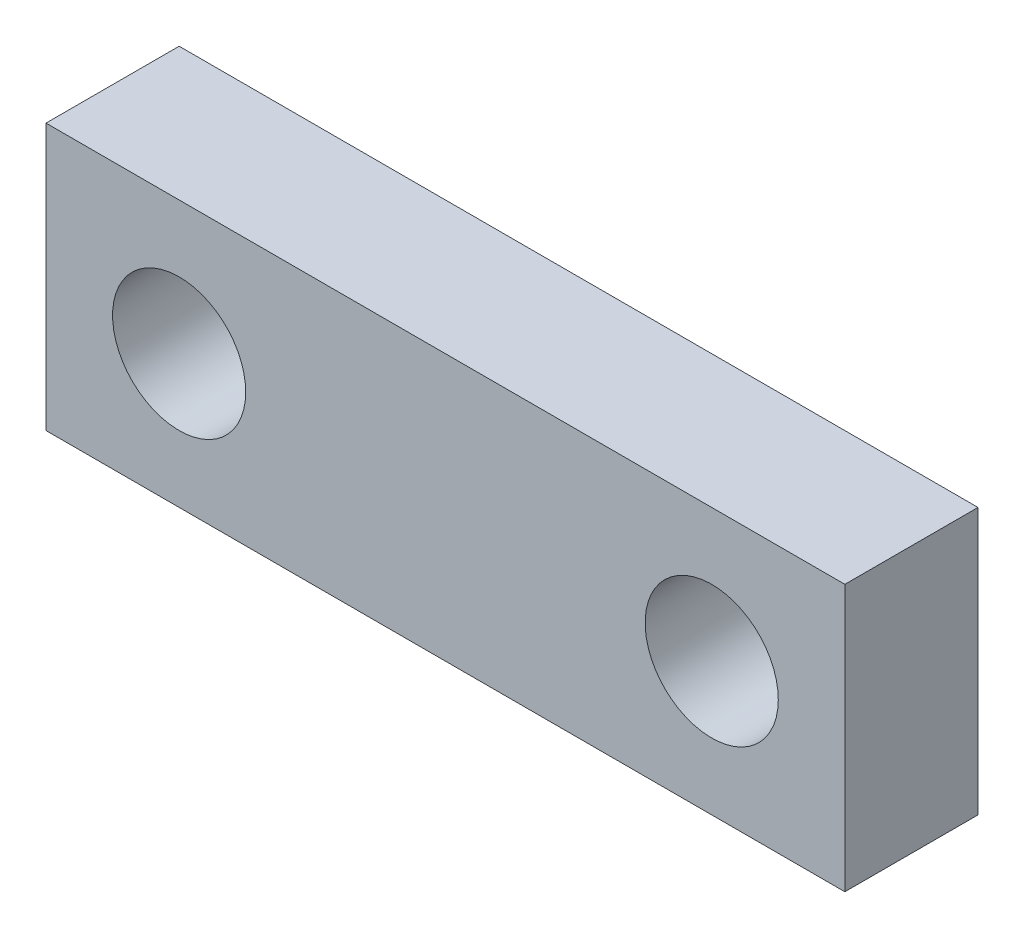
ISO-10303-21;
HEADER;
FILE_DESCRIPTION(('STEP AP214'),'2;1');
FILE_NAME('part.step','',(''),(''),'','','');
FILE_SCHEMA(('AUTOMOTIVE_DESIGN { 1 0 10303 214 1 1 1 1 }'));
ENDSEC;
DATA;
#1=APPLICATION_CONTEXT('core data for automotive mechanical design processes');
#2=APPLICATION_PROTOCOL_DEFINITION('international standard','automotive_design',2000,#1);
#3=PRODUCT_CONTEXT('',#1,'mechanical');
#4=PRODUCT('Part','Part','',(#3));
#5=PRODUCT_RELATED_PRODUCT_CATEGORY('part','',(#4));
#6=PRODUCT_DEFINITION_FORMATION('','',#4);
#7=PRODUCT_DEFINITION_CONTEXT('part definition',#1,'design');
#8=PRODUCT_DEFINITION('design','',#6,#7);
#9=PRODUCT_DEFINITION_SHAPE('','',#8);
#10=(LENGTH_UNIT() NAMED_UNIT(*) SI_UNIT(.MILLI.,.METRE.));
#11=(NAMED_UNIT(*) PLANE_ANGLE_UNIT() SI_UNIT($,.RADIAN.));
#12=(NAMED_UNIT(*) SI_UNIT($,.STERADIAN.) SOLID_ANGLE_UNIT());
#13=UNCERTAINTY_MEASURE_WITH_UNIT(LENGTH_MEASURE(1.E-05),#10,'distance_accuracy_value','');
#14=(GEOMETRIC_REPRESENTATION_CONTEXT(3) GLOBAL_UNCERTAINTY_ASSIGNED_CONTEXT((#13)) GLOBAL_UNIT_ASSIGNED_CONTEXT((#10,
#11,#12)) REPRESENTATION_CONTEXT('',''));
#15=CARTESIAN_POINT('',(0.,0.,0.));
#16=DIRECTION('',(0.,0.,1.));
#17=DIRECTION('',(1.,0.,0.));
#18=AXIS2_PLACEMENT_3D('',#15,#16,#17);
#19=CARTESIAN_POINT('',(0.,0.,5.));
#20=DIRECTION('',(0.,0.,1.));
#21=DIRECTION('',(1.,0.,0.));
#22=AXIS2_PLACEMENT_3D('',#19,#20,#21);
#23=PLANE('',#22);
#24=CARTESIAN_POINT('',(-25.,5.,5.));
#25=DIRECTION('',(0.,0.,1.));
#26=DIRECTION('',(1.,0.,0.));
#27=AXIS2_PLACEMENT_3D('',#24,#25,#26);
#28=CIRCLE('',#27,2.5);
#29=CARTESIAN_POINT('',(-22.5,5.,5.));
#30=VERTEX_POINT('',#29);
#31=EDGE_CURVE('E104',#30,#30,#28,.T.);
#32=ORIENTED_EDGE('',*,*,#31,.F.);
#33=EDGE_LOOP('',(#32));
#34=FACE_BOUND('',#33,.T.);
#35=DIRECTION('',(0.,1.,0.));
#36=VECTOR('',#35,1.);
#37=CARTESIAN_POINT('',(0.,0.,5.));
#38=LINE('',#37,#36);
#39=CARTESIAN_POINT('',(0.,0.,5.));
#40=VERTEX_POINT('',#39);
#41=CARTESIAN_POINT('',(0.,10.,5.));
#42=VERTEX_POINT('',#41);
#43=EDGE_CURVE('E89',#40,#42,#38,.T.);
#44=ORIENTED_EDGE('',*,*,#43,.T.);
#45=DIRECTION('',(-1.,0.,0.));
#46=VECTOR('',#45,1.);
#47=CARTESIAN_POINT('',(0.,10.,5.));
#48=LINE('',#47,#46);
#49=CARTESIAN_POINT('',(-30.,9.99999999999999,5.));
#50=VERTEX_POINT('',#49);
#51=EDGE_CURVE('E84',#42,#50,#48,.T.);
#52=ORIENTED_EDGE('',*,*,#51,.T.);
#53=DIRECTION('',(0.,-1.,0.));
#54=VECTOR('',#53,1.);
#55=CARTESIAN_POINT('',(-30.,0.,5.));
#56=LINE('',#55,#54);
#57=CARTESIAN_POINT('',(-30.,0.,5.));
#58=VERTEX_POINT('',#57);
#59=EDGE_CURVE('E87',#50,#58,#56,.T.);
#60=ORIENTED_EDGE('',*,*,#59,.T.);
#61=DIRECTION('',(1.,0.,0.));
#62=VECTOR('',#61,1.);
#63=CARTESIAN_POINT('',(0.,0.,5.));
#64=LINE('',#63,#62);
#65=EDGE_CURVE('E54',#58,#40,#64,.T.);
#66=ORIENTED_EDGE('',*,*,#65,.T.);
#67=EDGE_LOOP('',(#44,#52,#60,#66));
#68=FACE_BOUND('',#67,.T.);
#69=CARTESIAN_POINT('',(-5.,5.,5.));
#70=DIRECTION('',(0.,0.,1.));
#71=DIRECTION('',(1.,0.,0.));
#72=AXIS2_PLACEMENT_3D('',#69,#70,#71);
#73=CIRCLE('',#72,2.5);
#74=CARTESIAN_POINT('',(-2.5,5.,5.));
#75=VERTEX_POINT('',#74);
#76=EDGE_CURVE('E119',#75,#75,#73,.T.);
#77=ORIENTED_EDGE('',*,*,#76,.F.);
#78=EDGE_LOOP('',(#77));
#79=FACE_BOUND('',#78,.T.);
#80=ADVANCED_FACE('F37',(#34,#68,#79),#23,.T.);
#81=CARTESIAN_POINT('',(0.,0.,0.));
#82=DIRECTION('',(0.,0.,1.));
#83=DIRECTION('',(1.,0.,0.));
#84=AXIS2_PLACEMENT_3D('',#81,#82,#83);
#85=PLANE('',#84);
#86=DIRECTION('',(0.,1.,0.));
#87=VECTOR('',#86,1.);
#88=CARTESIAN_POINT('',(0.,0.,0.));
#89=LINE('',#88,#87);
#90=CARTESIAN_POINT('',(0.,0.,0.));
#91=VERTEX_POINT('',#90);
#92=CARTESIAN_POINT('',(0.,10.,0.));
#93=VERTEX_POINT('',#92);
#94=EDGE_CURVE('E101',#91,#93,#89,.T.);
#95=ORIENTED_EDGE('',*,*,#94,.F.);
#96=DIRECTION('',(1.,0.,0.));
#97=VECTOR('',#96,1.);
#98=CARTESIAN_POINT('',(0.,0.,0.));
#99=LINE('',#98,#97);
#100=CARTESIAN_POINT('',(-30.,0.,0.));
#101=VERTEX_POINT('',#100);
#102=EDGE_CURVE('E77',#101,#91,#99,.T.);
#103=ORIENTED_EDGE('',*,*,#102,.F.);
#104=DIRECTION('',(0.,-1.,0.));
#105=VECTOR('',#104,1.);
#106=CARTESIAN_POINT('',(-30.,0.,0.));
#107=LINE('',#106,#105);
#108=CARTESIAN_POINT('',(-30.,9.99999999999999,0.));
#109=VERTEX_POINT('',#108);
#110=EDGE_CURVE('E71',#109,#101,#107,.T.);
#111=ORIENTED_EDGE('',*,*,#110,.F.);
#112=DIRECTION('',(-1.,0.,0.));
#113=VECTOR('',#112,1.);
#114=CARTESIAN_POINT('',(0.,10.,0.));
#115=LINE('',#114,#113);
#116=EDGE_CURVE('E93',#93,#109,#115,.T.);
#117=ORIENTED_EDGE('',*,*,#116,.F.);
#118=EDGE_LOOP('',(#95,#103,#111,#117));
#119=FACE_BOUND('',#118,.T.);
#120=CARTESIAN_POINT('',(-25.,5.,0.));
#121=DIRECTION('',(0.,0.,1.));
#122=DIRECTION('',(1.,0.,0.));
#123=AXIS2_PLACEMENT_3D('',#120,#121,#122);
#124=CIRCLE('',#123,2.5);
#125=CARTESIAN_POINT('',(-22.5,5.,0.));
#126=VERTEX_POINT('',#125);
#127=EDGE_CURVE('E116',#126,#126,#124,.T.);
#128=ORIENTED_EDGE('',*,*,#127,.T.);
#129=EDGE_LOOP('',(#128));
#130=FACE_BOUND('',#129,.T.);
#131=CARTESIAN_POINT('',(-5.,5.,0.));
#132=DIRECTION('',(0.,0.,1.));
#133=DIRECTION('',(1.,0.,0.));
#134=AXIS2_PLACEMENT_3D('',#131,#132,#133);
#135=CIRCLE('',#134,2.5);
#136=CARTESIAN_POINT('',(-2.5,5.,0.));
#137=VERTEX_POINT('',#136);
#138=EDGE_CURVE('E122',#137,#137,#135,.T.);
#139=ORIENTED_EDGE('',*,*,#138,.T.);
#140=EDGE_LOOP('',(#139));
#141=FACE_BOUND('',#140,.T.);
#142=ADVANCED_FACE('F112',(#119,#130,#141),#85,.F.);
#143=CARTESIAN_POINT('',(0.,0.,5.));
#144=DIRECTION('',(-1.,0.,0.));
#145=DIRECTION('',(0.,-1.,0.));
#146=AXIS2_PLACEMENT_3D('',#143,#144,#145);
#147=PLANE('',#146);
#148=ORIENTED_EDGE('',*,*,#94,.T.);
#149=DIRECTION('',(0.,0.,-1.));
#150=VECTOR('',#149,1.);
#151=CARTESIAN_POINT('',(0.,10.,5.));
#152=LINE('',#151,#150);
#153=EDGE_CURVE('E11',#42,#93,#152,.T.);
#154=ORIENTED_EDGE('',*,*,#153,.F.);
#155=ORIENTED_EDGE('',*,*,#43,.F.);
#156=DIRECTION('',(0.,0.,-1.));
#157=VECTOR('',#156,1.);
#158=CARTESIAN_POINT('',(0.,0.,5.));
#159=LINE('',#158,#157);
#160=EDGE_CURVE('E97',#40,#91,#159,.T.);
#161=ORIENTED_EDGE('',*,*,#160,.T.);
#162=EDGE_LOOP('',(#148,#154,#155,#161));
#163=FACE_BOUND('',#162,.T.);
#164=ADVANCED_FACE('F39',(#163),#147,.F.);
#165=CARTESIAN_POINT('',(0.,10.,5.));
#166=DIRECTION('',(0.,-1.,0.));
#167=DIRECTION('',(1.,0.,0.));
#168=AXIS2_PLACEMENT_3D('',#165,#166,#167);
#169=PLANE('',#168);
#170=ORIENTED_EDGE('',*,*,#116,.T.);
#171=DIRECTION('',(0.,0.,-1.));
#172=VECTOR('',#171,1.);
#173=CARTESIAN_POINT('',(-30.,9.99999999999999,5.));
#174=LINE('',#173,#172);
#175=EDGE_CURVE('E46',#50,#109,#174,.T.);
#176=ORIENTED_EDGE('',*,*,#175,.F.);
#177=ORIENTED_EDGE('',*,*,#51,.F.);
#178=ORIENTED_EDGE('',*,*,#153,.T.);
#179=EDGE_LOOP('',(#170,#176,#177,#178));
#180=FACE_BOUND('',#179,.T.);
#181=ADVANCED_FACE('F92',(#180),#169,.F.);
#182=CARTESIAN_POINT('',(-30.,0.,5.));
#183=DIRECTION('',(1.,0.,0.));
#184=DIRECTION('',(0.,0.,-1.));
#185=AXIS2_PLACEMENT_3D('',#182,#183,#184);
#186=PLANE('',#185);
#187=ORIENTED_EDGE('',*,*,#110,.T.);
#188=DIRECTION('',(0.,0.,-1.));
#189=VECTOR('',#188,1.);
#190=CARTESIAN_POINT('',(-30.,0.,5.));
#191=LINE('',#190,#189);
#192=EDGE_CURVE('E94',#58,#101,#191,.T.);
#193=ORIENTED_EDGE('',*,*,#192,.F.);
#194=ORIENTED_EDGE('',*,*,#59,.F.);
#195=ORIENTED_EDGE('',*,*,#175,.T.);
#196=EDGE_LOOP('',(#187,#193,#194,#195));
#197=FACE_BOUND('',#196,.T.);
#198=ADVANCED_FACE('F95',(#197),#186,.F.);
#199=CARTESIAN_POINT('',(0.,0.,5.));
#200=DIRECTION('',(0.,1.,0.));
#201=DIRECTION('',(-1.,0.,0.));
#202=AXIS2_PLACEMENT_3D('',#199,#200,#201);
#203=PLANE('',#202);
#204=ORIENTED_EDGE('',*,*,#102,.T.);
#205=ORIENTED_EDGE('',*,*,#160,.F.);
#206=ORIENTED_EDGE('',*,*,#65,.F.);
#207=ORIENTED_EDGE('',*,*,#192,.T.);
#208=EDGE_LOOP('',(#204,#205,#206,#207));
#209=FACE_BOUND('',#208,.T.);
#210=ADVANCED_FACE('F109',(#209),#203,.F.);
#211=CARTESIAN_POINT('',(-25.,5.,5.));
#212=DIRECTION('',(0.,0.,-1.));
#213=DIRECTION('',(-1.,0.,0.));
#214=AXIS2_PLACEMENT_3D('',#211,#212,#213);
#215=CYLINDRICAL_SURFACE('',#214,2.5);
#216=ORIENTED_EDGE('',*,*,#31,.T.);
#217=EDGE_LOOP('',(#216));
#218=FACE_BOUND('',#217,.T.);
#219=ORIENTED_EDGE('',*,*,#127,.F.);
#220=EDGE_LOOP('',(#219));
#221=FACE_BOUND('',#220,.T.);
#222=ADVANCED_FACE('F139',(#218,#221),#215,.F.);
#223=CARTESIAN_POINT('',(-5.,5.,5.));
#224=DIRECTION('',(0.,0.,-1.));
#225=DIRECTION('',(-1.,0.,0.));
#226=AXIS2_PLACEMENT_3D('',#223,#224,#225);
#227=CYLINDRICAL_SURFACE('',#226,2.5);
#228=ORIENTED_EDGE('',*,*,#76,.T.);
#229=EDGE_LOOP('',(#228));
#230=FACE_BOUND('',#229,.T.);
#231=ORIENTED_EDGE('',*,*,#138,.F.);
#232=EDGE_LOOP('',(#231));
#233=FACE_BOUND('',#232,.T.);
#234=ADVANCED_FACE('F128',(#230,#233),#227,.F.);
#235=CLOSED_SHELL('',(#80,#142,#164,#181,#198,#210,#222,#234));
#236=MANIFOLD_SOLID_BREP('B2',#235);
#237=ADVANCED_BREP_SHAPE_REPRESENTATION('',(#18,#236),#14);
#238=SHAPE_DEFINITION_REPRESENTATION(#9,#237);
ENDSEC;
END-ISO-10303-21;
